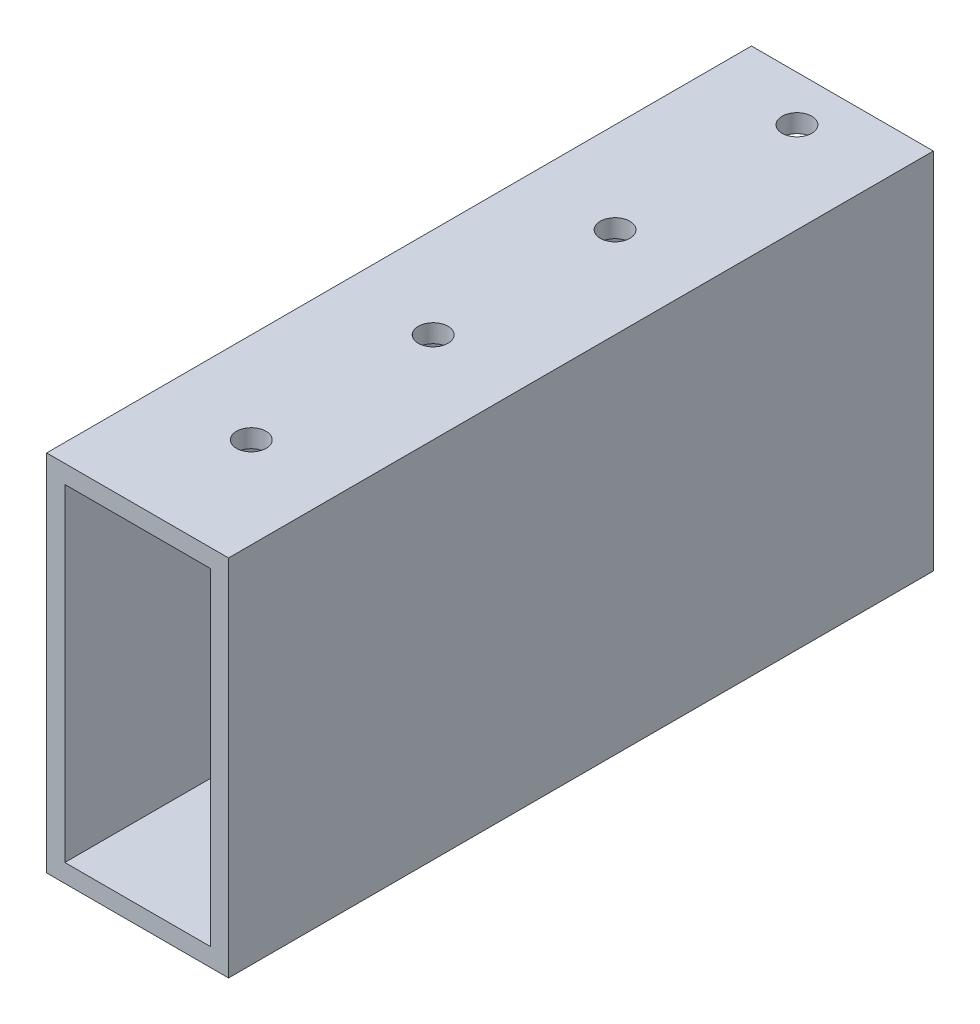
ISO-10303-21;
HEADER;
FILE_DESCRIPTION(('STEP AP214'),'2;1');
FILE_NAME('part.step','',(''),(''),'','','');
FILE_SCHEMA(('AUTOMOTIVE_DESIGN { 1 0 10303 214 1 1 1 1 }'));
ENDSEC;
DATA;
#1=APPLICATION_CONTEXT('core data for automotive mechanical design processes');
#2=APPLICATION_PROTOCOL_DEFINITION('international standard','automotive_design',2000,#1);
#3=PRODUCT_CONTEXT('',#1,'mechanical');
#4=PRODUCT('Part','Part','',(#3));
#5=PRODUCT_RELATED_PRODUCT_CATEGORY('part','',(#4));
#6=PRODUCT_DEFINITION_FORMATION('','',#4);
#7=PRODUCT_DEFINITION_CONTEXT('part definition',#1,'design');
#8=PRODUCT_DEFINITION('design','',#6,#7);
#9=PRODUCT_DEFINITION_SHAPE('','',#8);
#10=(LENGTH_UNIT() NAMED_UNIT(*) SI_UNIT(.MILLI.,.METRE.));
#11=(NAMED_UNIT(*) PLANE_ANGLE_UNIT() SI_UNIT($,.RADIAN.));
#12=(NAMED_UNIT(*) SI_UNIT($,.STERADIAN.) SOLID_ANGLE_UNIT());
#13=UNCERTAINTY_MEASURE_WITH_UNIT(LENGTH_MEASURE(1.E-05),#10,'distance_accuracy_value','');
#14=(GEOMETRIC_REPRESENTATION_CONTEXT(3) GLOBAL_UNCERTAINTY_ASSIGNED_CONTEXT((#13)) GLOBAL_UNIT_ASSIGNED_CONTEXT((#10,
#11,#12)) REPRESENTATION_CONTEXT('',''));
#15=CARTESIAN_POINT('',(0.,0.,0.));
#16=DIRECTION('',(0.,0.,1.));
#17=DIRECTION('',(1.,0.,0.));
#18=AXIS2_PLACEMENT_3D('',#15,#16,#17);
#19=CARTESIAN_POINT('',(0.,-25.4,6.35));
#20=DIRECTION('',(0.,1.,0.));
#21=DIRECTION('',(0.,0.,1.));
#22=AXIS2_PLACEMENT_3D('',#19,#20,#21);
#23=CYLINDRICAL_SURFACE('',#22,2.0701);
#24=CARTESIAN_POINT('',(0.,22.86,6.35));
#25=DIRECTION('',(0.,1.,0.));
#26=DIRECTION('',(0.,0.,1.));
#27=AXIS2_PLACEMENT_3D('',#24,#25,#26);
#28=CIRCLE('',#27,2.0701);
#29=CARTESIAN_POINT('',(0.,22.86,8.4201));
#30=VERTEX_POINT('',#29);
#31=EDGE_CURVE('E125',#30,#30,#28,.T.);
#32=ORIENTED_EDGE('',*,*,#31,.F.);
#33=EDGE_LOOP('',(#32));
#34=FACE_BOUND('',#33,.T.);
#35=CARTESIAN_POINT('',(0.,25.4,6.35));
#36=DIRECTION('',(0.,1.,0.));
#37=DIRECTION('',(0.,0.,1.));
#38=AXIS2_PLACEMENT_3D('',#35,#36,#37);
#39=CIRCLE('',#38,2.0701);
#40=CARTESIAN_POINT('',(0.,25.4,8.4201));
#41=VERTEX_POINT('',#40);
#42=EDGE_CURVE('E101',#41,#41,#39,.T.);
#43=ORIENTED_EDGE('',*,*,#42,.T.);
#44=EDGE_LOOP('',(#43));
#45=FACE_BOUND('',#44,.T.);
#46=ADVANCED_FACE('F17',(#34,#45),#23,.F.);
#47=CARTESIAN_POINT('',(0.,-25.4,31.75));
#48=DIRECTION('',(0.,1.,0.));
#49=DIRECTION('',(0.,0.,1.));
#50=AXIS2_PLACEMENT_3D('',#47,#48,#49);
#51=CYLINDRICAL_SURFACE('',#50,2.0701);
#52=CARTESIAN_POINT('',(0.,22.86,31.75));
#53=DIRECTION('',(0.,1.,0.));
#54=DIRECTION('',(0.,0.,1.));
#55=AXIS2_PLACEMENT_3D('',#52,#53,#54);
#56=CIRCLE('',#55,2.0701);
#57=CARTESIAN_POINT('',(0.,22.86,33.8201));
#58=VERTEX_POINT('',#57);
#59=EDGE_CURVE('E155',#58,#58,#56,.T.);
#60=ORIENTED_EDGE('',*,*,#59,.F.);
#61=EDGE_LOOP('',(#60));
#62=FACE_BOUND('',#61,.T.);
#63=CARTESIAN_POINT('',(0.,25.4,31.75));
#64=DIRECTION('',(0.,1.,0.));
#65=DIRECTION('',(0.,0.,1.));
#66=AXIS2_PLACEMENT_3D('',#63,#64,#65);
#67=CIRCLE('',#66,2.0701);
#68=CARTESIAN_POINT('',(0.,25.4,33.8201));
#69=VERTEX_POINT('',#68);
#70=EDGE_CURVE('E145',#69,#69,#67,.T.);
#71=ORIENTED_EDGE('',*,*,#70,.T.);
#72=EDGE_LOOP('',(#71));
#73=FACE_BOUND('',#72,.T.);
#74=ADVANCED_FACE('F341',(#62,#73),#51,.F.);
#75=CARTESIAN_POINT('',(0.,-25.4,57.15));
#76=DIRECTION('',(0.,1.,0.));
#77=DIRECTION('',(0.,0.,1.));
#78=AXIS2_PLACEMENT_3D('',#75,#76,#77);
#79=CYLINDRICAL_SURFACE('',#78,2.07010000000001);
#80=CARTESIAN_POINT('',(0.,22.86,57.15));
#81=DIRECTION('',(0.,1.,0.));
#82=DIRECTION('',(0.,0.,1.));
#83=AXIS2_PLACEMENT_3D('',#80,#81,#82);
#84=CIRCLE('',#83,2.07010000000001);
#85=CARTESIAN_POINT('',(0.,22.86,59.2201));
#86=VERTEX_POINT('',#85);
#87=EDGE_CURVE('E152',#86,#86,#84,.T.);
#88=ORIENTED_EDGE('',*,*,#87,.F.);
#89=EDGE_LOOP('',(#88));
#90=FACE_BOUND('',#89,.T.);
#91=CARTESIAN_POINT('',(0.,25.4,57.15));
#92=DIRECTION('',(0.,1.,0.));
#93=DIRECTION('',(0.,0.,1.));
#94=AXIS2_PLACEMENT_3D('',#91,#92,#93);
#95=CIRCLE('',#94,2.07010000000001);
#96=CARTESIAN_POINT('',(0.,25.4,59.2201));
#97=VERTEX_POINT('',#96);
#98=EDGE_CURVE('E142',#97,#97,#95,.T.);
#99=ORIENTED_EDGE('',*,*,#98,.T.);
#100=EDGE_LOOP('',(#99));
#101=FACE_BOUND('',#100,.T.);
#102=ADVANCED_FACE('F187',(#90,#101),#79,.F.);
#103=CARTESIAN_POINT('',(0.,-25.4,82.55));
#104=DIRECTION('',(0.,1.,0.));
#105=DIRECTION('',(0.,0.,1.));
#106=AXIS2_PLACEMENT_3D('',#103,#104,#105);
#107=CYLINDRICAL_SURFACE('',#106,2.07010000000001);
#108=CARTESIAN_POINT('',(0.,22.86,82.55));
#109=DIRECTION('',(0.,1.,0.));
#110=DIRECTION('',(0.,0.,1.));
#111=AXIS2_PLACEMENT_3D('',#108,#109,#110);
#112=CIRCLE('',#111,2.07010000000001);
#113=CARTESIAN_POINT('',(0.,22.86,84.6201));
#114=VERTEX_POINT('',#113);
#115=EDGE_CURVE('E122',#114,#114,#112,.T.);
#116=ORIENTED_EDGE('',*,*,#115,.F.);
#117=EDGE_LOOP('',(#116));
#118=FACE_BOUND('',#117,.T.);
#119=CARTESIAN_POINT('',(0.,25.4,82.55));
#120=DIRECTION('',(0.,1.,0.));
#121=DIRECTION('',(0.,0.,1.));
#122=AXIS2_PLACEMENT_3D('',#119,#120,#121);
#123=CIRCLE('',#122,2.07010000000001);
#124=CARTESIAN_POINT('',(0.,25.4,84.6201));
#125=VERTEX_POINT('',#124);
#126=EDGE_CURVE('E117',#125,#125,#123,.T.);
#127=ORIENTED_EDGE('',*,*,#126,.T.);
#128=EDGE_LOOP('',(#127));
#129=FACE_BOUND('',#128,.T.);
#130=ADVANCED_FACE('F176',(#118,#129),#107,.F.);
#131=CARTESIAN_POINT('',(0.,-25.4,6.35));
#132=DIRECTION('',(0.,1.,0.));
#133=DIRECTION('',(0.,0.,1.));
#134=AXIS2_PLACEMENT_3D('',#131,#132,#133);
#135=CYLINDRICAL_SURFACE('',#134,2.0701);
#136=CARTESIAN_POINT('',(0.,-25.4,6.35));
#137=DIRECTION('',(0.,1.,0.));
#138=DIRECTION('',(0.,0.,1.));
#139=AXIS2_PLACEMENT_3D('',#136,#137,#138);
#140=CIRCLE('',#139,2.0701);
#141=CARTESIAN_POINT('',(0.,-25.4,8.4201));
#142=VERTEX_POINT('',#141);
#143=EDGE_CURVE('E137',#142,#142,#140,.F.);
#144=ORIENTED_EDGE('',*,*,#143,.T.);
#145=EDGE_LOOP('',(#144));
#146=FACE_BOUND('',#145,.T.);
#147=CARTESIAN_POINT('',(0.,-22.86,6.35));
#148=DIRECTION('',(0.,1.,0.));
#149=DIRECTION('',(0.,0.,1.));
#150=AXIS2_PLACEMENT_3D('',#147,#148,#149);
#151=CIRCLE('',#150,2.0701);
#152=CARTESIAN_POINT('',(0.,-22.86,8.4201));
#153=VERTEX_POINT('',#152);
#154=EDGE_CURVE('E20',#153,#153,#151,.F.);
#155=ORIENTED_EDGE('',*,*,#154,.F.);
#156=EDGE_LOOP('',(#155));
#157=FACE_BOUND('',#156,.T.);
#158=ADVANCED_FACE('F173',(#146,#157),#135,.F.);
#159=CARTESIAN_POINT('',(0.,-25.4,31.75));
#160=DIRECTION('',(0.,1.,0.));
#161=DIRECTION('',(0.,0.,1.));
#162=AXIS2_PLACEMENT_3D('',#159,#160,#161);
#163=CYLINDRICAL_SURFACE('',#162,2.0701);
#164=CARTESIAN_POINT('',(0.,-25.4,31.75));
#165=DIRECTION('',(0.,1.,0.));
#166=DIRECTION('',(0.,0.,1.));
#167=AXIS2_PLACEMENT_3D('',#164,#165,#166);
#168=CIRCLE('',#167,2.0701);
#169=CARTESIAN_POINT('',(0.,-25.4,33.8201));
#170=VERTEX_POINT('',#169);
#171=EDGE_CURVE('E134',#170,#170,#168,.F.);
#172=ORIENTED_EDGE('',*,*,#171,.T.);
#173=EDGE_LOOP('',(#172));
#174=FACE_BOUND('',#173,.T.);
#175=CARTESIAN_POINT('',(0.,-22.86,31.75));
#176=DIRECTION('',(0.,1.,0.));
#177=DIRECTION('',(0.,0.,1.));
#178=AXIS2_PLACEMENT_3D('',#175,#176,#177);
#179=CIRCLE('',#178,2.0701);
#180=CARTESIAN_POINT('',(0.,-22.86,33.8201));
#181=VERTEX_POINT('',#180);
#182=EDGE_CURVE('E164',#181,#181,#179,.F.);
#183=ORIENTED_EDGE('',*,*,#182,.F.);
#184=EDGE_LOOP('',(#183));
#185=FACE_BOUND('',#184,.T.);
#186=ADVANCED_FACE('F175',(#174,#185),#163,.F.);
#187=CARTESIAN_POINT('',(0.,-25.4,57.15));
#188=DIRECTION('',(0.,1.,0.));
#189=DIRECTION('',(0.,0.,1.));
#190=AXIS2_PLACEMENT_3D('',#187,#188,#189);
#191=CYLINDRICAL_SURFACE('',#190,2.07010000000001);
#192=CARTESIAN_POINT('',(0.,-25.4,57.15));
#193=DIRECTION('',(0.,1.,0.));
#194=DIRECTION('',(0.,0.,1.));
#195=AXIS2_PLACEMENT_3D('',#192,#193,#194);
#196=CIRCLE('',#195,2.07010000000001);
#197=CARTESIAN_POINT('',(0.,-25.4,59.2201));
#198=VERTEX_POINT('',#197);
#199=EDGE_CURVE('E131',#198,#198,#196,.F.);
#200=ORIENTED_EDGE('',*,*,#199,.T.);
#201=EDGE_LOOP('',(#200));
#202=FACE_BOUND('',#201,.T.);
#203=CARTESIAN_POINT('',(0.,-22.86,57.15));
#204=DIRECTION('',(0.,1.,0.));
#205=DIRECTION('',(0.,0.,1.));
#206=AXIS2_PLACEMENT_3D('',#203,#204,#205);
#207=CIRCLE('',#206,2.07010000000001);
#208=CARTESIAN_POINT('',(0.,-22.86,59.2201));
#209=VERTEX_POINT('',#208);
#210=EDGE_CURVE('E162',#209,#209,#207,.F.);
#211=ORIENTED_EDGE('',*,*,#210,.F.);
#212=EDGE_LOOP('',(#211));
#213=FACE_BOUND('',#212,.T.);
#214=ADVANCED_FACE('F184',(#202,#213),#191,.F.);
#215=CARTESIAN_POINT('',(0.,-25.4,82.55));
#216=DIRECTION('',(0.,1.,0.));
#217=DIRECTION('',(0.,0.,1.));
#218=AXIS2_PLACEMENT_3D('',#215,#216,#217);
#219=CYLINDRICAL_SURFACE('',#218,2.07010000000001);
#220=CARTESIAN_POINT('',(0.,-25.4,82.55));
#221=DIRECTION('',(0.,1.,0.));
#222=DIRECTION('',(0.,0.,1.));
#223=AXIS2_PLACEMENT_3D('',#220,#221,#222);
#224=CIRCLE('',#223,2.07010000000001);
#225=CARTESIAN_POINT('',(0.,-25.4,84.6201));
#226=VERTEX_POINT('',#225);
#227=EDGE_CURVE('E127',#226,#226,#224,.F.);
#228=ORIENTED_EDGE('',*,*,#227,.T.);
#229=EDGE_LOOP('',(#228));
#230=FACE_BOUND('',#229,.T.);
#231=CARTESIAN_POINT('',(0.,-22.86,82.55));
#232=DIRECTION('',(0.,1.,0.));
#233=DIRECTION('',(0.,0.,1.));
#234=AXIS2_PLACEMENT_3D('',#231,#232,#233);
#235=CIRCLE('',#234,2.07010000000001);
#236=CARTESIAN_POINT('',(0.,-22.86,84.6201));
#237=VERTEX_POINT('',#236);
#238=EDGE_CURVE('E126',#237,#237,#235,.F.);
#239=ORIENTED_EDGE('',*,*,#238,.F.);
#240=EDGE_LOOP('',(#239));
#241=FACE_BOUND('',#240,.T.);
#242=ADVANCED_FACE('F226',(#230,#241),#219,.F.);
#243=CARTESIAN_POINT('',(12.7,-25.4,98.425));
#244=DIRECTION('',(-1.,0.,0.));
#245=DIRECTION('',(0.,0.,1.));
#246=AXIS2_PLACEMENT_3D('',#243,#244,#245);
#247=PLANE('',#246);
#248=DIRECTION('',(0.,0.,-1.));
#249=VECTOR('',#248,1.);
#250=CARTESIAN_POINT('',(12.7,25.4,98.425));
#251=LINE('',#250,#249);
#252=CARTESIAN_POINT('',(12.7,25.4,0.));
#253=VERTEX_POINT('',#252);
#254=CARTESIAN_POINT('',(12.7,25.4,98.425));
#255=VERTEX_POINT('',#254);
#256=EDGE_CURVE('E115',#253,#255,#251,.F.);
#257=ORIENTED_EDGE('',*,*,#256,.T.);
#258=DIRECTION('',(0.,1.,0.));
#259=VECTOR('',#258,1.);
#260=CARTESIAN_POINT('',(12.7,0.,98.425));
#261=LINE('',#260,#259);
#262=CARTESIAN_POINT('',(12.7,-25.4,98.425));
#263=VERTEX_POINT('',#262);
#264=EDGE_CURVE('E112',#263,#255,#261,.T.);
#265=ORIENTED_EDGE('',*,*,#264,.F.);
#266=DIRECTION('',(0.,0.,1.));
#267=VECTOR('',#266,1.);
#268=CARTESIAN_POINT('',(12.7,-25.4,98.425));
#269=LINE('',#268,#267);
#270=CARTESIAN_POINT('',(12.7,-25.4,0.));
#271=VERTEX_POINT('',#270);
#272=EDGE_CURVE('E413',#263,#271,#269,.F.);
#273=ORIENTED_EDGE('',*,*,#272,.T.);
#274=DIRECTION('',(0.,1.,0.));
#275=VECTOR('',#274,1.);
#276=CARTESIAN_POINT('',(12.7,0.,0.));
#277=LINE('',#276,#275);
#278=EDGE_CURVE('E385',#271,#253,#277,.T.);
#279=ORIENTED_EDGE('',*,*,#278,.T.);
#280=EDGE_LOOP('',(#257,#265,#273,#279));
#281=FACE_BOUND('',#280,.T.);
#282=ADVANCED_FACE('F222',(#281),#247,.F.);
#283=CARTESIAN_POINT('',(10.16,-22.86,98.425));
#284=DIRECTION('',(0.,1.,0.));
#285=DIRECTION('',(-1.,0.,0.));
#286=AXIS2_PLACEMENT_3D('',#283,#284,#285);
#287=PLANE('',#286);
#288=DIRECTION('',(1.,0.,0.));
#289=VECTOR('',#288,1.);
#290=CARTESIAN_POINT('',(0.,-22.86,98.425));
#291=LINE('',#290,#289);
#292=CARTESIAN_POINT('',(10.16,-22.86,98.425));
#293=VERTEX_POINT('',#292);
#294=CARTESIAN_POINT('',(-10.16,-22.86,98.425));
#295=VERTEX_POINT('',#294);
#296=EDGE_CURVE('E106',#293,#295,#291,.F.);
#297=ORIENTED_EDGE('',*,*,#296,.F.);
#298=DIRECTION('',(0.,0.,1.));
#299=VECTOR('',#298,1.);
#300=CARTESIAN_POINT('',(10.16,-22.86,98.425));
#301=LINE('',#300,#299);
#302=CARTESIAN_POINT('',(10.16,-22.86,0.));
#303=VERTEX_POINT('',#302);
#304=EDGE_CURVE('E102',#303,#293,#301,.T.);
#305=ORIENTED_EDGE('',*,*,#304,.F.);
#306=DIRECTION('',(1.,0.,0.));
#307=VECTOR('',#306,1.);
#308=CARTESIAN_POINT('',(0.,-22.86,0.));
#309=LINE('',#308,#307);
#310=CARTESIAN_POINT('',(-10.16,-22.86,0.));
#311=VERTEX_POINT('',#310);
#312=EDGE_CURVE('E406',#303,#311,#309,.F.);
#313=ORIENTED_EDGE('',*,*,#312,.T.);
#314=DIRECTION('',(0.,0.,-1.));
#315=VECTOR('',#314,1.);
#316=CARTESIAN_POINT('',(-10.16,-22.86,98.425));
#317=LINE('',#316,#315);
#318=EDGE_CURVE('E123',#295,#311,#317,.T.);
#319=ORIENTED_EDGE('',*,*,#318,.F.);
#320=EDGE_LOOP('',(#297,#305,#313,#319));
#321=FACE_BOUND('',#320,.T.);
#322=ORIENTED_EDGE('',*,*,#238,.T.);
#323=EDGE_LOOP('',(#322));
#324=FACE_BOUND('',#323,.T.);
#325=ORIENTED_EDGE('',*,*,#210,.T.);
#326=EDGE_LOOP('',(#325));
#327=FACE_BOUND('',#326,.T.);
#328=ORIENTED_EDGE('',*,*,#182,.T.);
#329=EDGE_LOOP('',(#328));
#330=FACE_BOUND('',#329,.T.);
#331=ORIENTED_EDGE('',*,*,#154,.T.);
#332=EDGE_LOOP('',(#331));
#333=FACE_BOUND('',#332,.T.);
#334=ADVANCED_FACE('F171',(#321,#324,#327,#330,#333),#287,.T.);
#335=CARTESIAN_POINT('',(-10.16,-22.86,98.425));
#336=DIRECTION('',(1.,0.,0.));
#337=DIRECTION('',(0.,0.,-1.));
#338=AXIS2_PLACEMENT_3D('',#335,#336,#337);
#339=PLANE('',#338);
#340=DIRECTION('',(0.,1.,0.));
#341=VECTOR('',#340,1.);
#342=CARTESIAN_POINT('',(-10.16,0.,98.425));
#343=LINE('',#342,#341);
#344=CARTESIAN_POINT('',(-10.16,22.86,98.425));
#345=VERTEX_POINT('',#344);
#346=EDGE_CURVE('E88',#295,#345,#343,.T.);
#347=ORIENTED_EDGE('',*,*,#346,.F.);
#348=ORIENTED_EDGE('',*,*,#318,.T.);
#349=DIRECTION('',(0.,1.,0.));
#350=VECTOR('',#349,1.);
#351=CARTESIAN_POINT('',(-10.16,0.,0.));
#352=LINE('',#351,#350);
#353=CARTESIAN_POINT('',(-10.16,22.86,0.));
#354=VERTEX_POINT('',#353);
#355=EDGE_CURVE('E403',#311,#354,#352,.T.);
#356=ORIENTED_EDGE('',*,*,#355,.T.);
#357=DIRECTION('',(0.,0.,1.));
#358=VECTOR('',#357,1.);
#359=CARTESIAN_POINT('',(-10.16,22.86,98.425));
#360=LINE('',#359,#358);
#361=EDGE_CURVE('E120',#345,#354,#360,.F.);
#362=ORIENTED_EDGE('',*,*,#361,.F.);
#363=EDGE_LOOP('',(#347,#348,#356,#362));
#364=FACE_BOUND('',#363,.T.);
#365=ADVANCED_FACE('F216',(#364),#339,.T.);
#366=CARTESIAN_POINT('',(10.16,22.86,98.425));
#367=DIRECTION('',(0.,-1.,0.));
#368=DIRECTION('',(1.,0.,0.));
#369=AXIS2_PLACEMENT_3D('',#366,#367,#368);
#370=PLANE('',#369);
#371=DIRECTION('',(1.,0.,0.));
#372=VECTOR('',#371,1.);
#373=CARTESIAN_POINT('',(0.,22.86,98.425));
#374=LINE('',#373,#372);
#375=CARTESIAN_POINT('',(10.16,22.86,98.425));
#376=VERTEX_POINT('',#375);
#377=EDGE_CURVE('E80',#345,#376,#374,.T.);
#378=ORIENTED_EDGE('',*,*,#377,.F.);
#379=ORIENTED_EDGE('',*,*,#361,.T.);
#380=DIRECTION('',(1.,0.,0.));
#381=VECTOR('',#380,1.);
#382=CARTESIAN_POINT('',(0.,22.86,0.));
#383=LINE('',#382,#381);
#384=CARTESIAN_POINT('',(10.16,22.86,0.));
#385=VERTEX_POINT('',#384);
#386=EDGE_CURVE('E97',#354,#385,#383,.T.);
#387=ORIENTED_EDGE('',*,*,#386,.T.);
#388=DIRECTION('',(0.,0.,1.));
#389=VECTOR('',#388,1.);
#390=CARTESIAN_POINT('',(10.16,22.86,98.425));
#391=LINE('',#390,#389);
#392=EDGE_CURVE('E93',#376,#385,#391,.F.);
#393=ORIENTED_EDGE('',*,*,#392,.F.);
#394=EDGE_LOOP('',(#378,#379,#387,#393));
#395=FACE_BOUND('',#394,.T.);
#396=ORIENTED_EDGE('',*,*,#115,.T.);
#397=EDGE_LOOP('',(#396));
#398=FACE_BOUND('',#397,.T.);
#399=ORIENTED_EDGE('',*,*,#87,.T.);
#400=EDGE_LOOP('',(#399));
#401=FACE_BOUND('',#400,.T.);
#402=ORIENTED_EDGE('',*,*,#59,.T.);
#403=EDGE_LOOP('',(#402));
#404=FACE_BOUND('',#403,.T.);
#405=ORIENTED_EDGE('',*,*,#31,.T.);
#406=EDGE_LOOP('',(#405));
#407=FACE_BOUND('',#406,.T.);
#408=ADVANCED_FACE('F94',(#395,#398,#401,#404,#407),#370,.T.);
#409=CARTESIAN_POINT('',(10.16,-22.86,98.425));
#410=DIRECTION('',(-1.,0.,0.));
#411=DIRECTION('',(0.,0.,1.));
#412=AXIS2_PLACEMENT_3D('',#409,#410,#411);
#413=PLANE('',#412);
#414=DIRECTION('',(0.,1.,0.));
#415=VECTOR('',#414,1.);
#416=CARTESIAN_POINT('',(10.16,0.,98.425));
#417=LINE('',#416,#415);
#418=EDGE_CURVE('E85',#376,#293,#417,.F.);
#419=ORIENTED_EDGE('',*,*,#418,.F.);
#420=ORIENTED_EDGE('',*,*,#392,.T.);
#421=DIRECTION('',(0.,1.,0.));
#422=VECTOR('',#421,1.);
#423=CARTESIAN_POINT('',(10.16,0.,0.));
#424=LINE('',#423,#422);
#425=EDGE_CURVE('E398',#385,#303,#424,.F.);
#426=ORIENTED_EDGE('',*,*,#425,.T.);
#427=ORIENTED_EDGE('',*,*,#304,.T.);
#428=EDGE_LOOP('',(#419,#420,#426,#427));
#429=FACE_BOUND('',#428,.T.);
#430=ADVANCED_FACE('F104',(#429),#413,.T.);
#431=CARTESIAN_POINT('',(12.7,25.4,98.425));
#432=DIRECTION('',(0.,-1.,0.));
#433=DIRECTION('',(0.,0.,-1.));
#434=AXIS2_PLACEMENT_3D('',#431,#432,#433);
#435=PLANE('',#434);
#436=DIRECTION('',(0.,0.,-1.));
#437=VECTOR('',#436,1.);
#438=CARTESIAN_POINT('',(-12.7,25.4,98.425));
#439=LINE('',#438,#437);
#440=CARTESIAN_POINT('',(-12.7,25.4,0.));
#441=VERTEX_POINT('',#440);
#442=CARTESIAN_POINT('',(-12.7,25.4,98.425));
#443=VERTEX_POINT('',#442);
#444=EDGE_CURVE('E390',#441,#443,#439,.F.);
#445=ORIENTED_EDGE('',*,*,#444,.T.);
#446=DIRECTION('',(1.,0.,0.));
#447=VECTOR('',#446,1.);
#448=CARTESIAN_POINT('',(0.,25.4,98.425));
#449=LINE('',#448,#447);
#450=EDGE_CURVE('E90',#255,#443,#449,.F.);
#451=ORIENTED_EDGE('',*,*,#450,.F.);
#452=ORIENTED_EDGE('',*,*,#256,.F.);
#453=DIRECTION('',(1.,0.,0.));
#454=VECTOR('',#453,1.);
#455=CARTESIAN_POINT('',(0.,25.4,0.));
#456=LINE('',#455,#454);
#457=EDGE_CURVE('E409',#253,#441,#456,.F.);
#458=ORIENTED_EDGE('',*,*,#457,.T.);
#459=EDGE_LOOP('',(#445,#451,#452,#458));
#460=FACE_BOUND('',#459,.T.);
#461=ORIENTED_EDGE('',*,*,#126,.F.);
#462=EDGE_LOOP('',(#461));
#463=FACE_BOUND('',#462,.T.);
#464=ORIENTED_EDGE('',*,*,#98,.F.);
#465=EDGE_LOOP('',(#464));
#466=FACE_BOUND('',#465,.T.);
#467=ORIENTED_EDGE('',*,*,#70,.F.);
#468=EDGE_LOOP('',(#467));
#469=FACE_BOUND('',#468,.T.);
#470=ORIENTED_EDGE('',*,*,#42,.F.);
#471=EDGE_LOOP('',(#470));
#472=FACE_BOUND('',#471,.T.);
#473=ADVANCED_FACE('F208',(#460,#463,#466,#469,#472),#435,.F.);
#474=CARTESIAN_POINT('',(0.,0.,98.425));
#475=DIRECTION('',(0.,0.,1.));
#476=DIRECTION('',(1.,0.,0.));
#477=AXIS2_PLACEMENT_3D('',#474,#475,#476);
#478=PLANE('',#477);
#479=ORIENTED_EDGE('',*,*,#296,.T.);
#480=ORIENTED_EDGE('',*,*,#346,.T.);
#481=ORIENTED_EDGE('',*,*,#377,.T.);
#482=ORIENTED_EDGE('',*,*,#418,.T.);
#483=EDGE_LOOP('',(#479,#480,#481,#482));
#484=FACE_BOUND('',#483,.T.);
#485=ORIENTED_EDGE('',*,*,#264,.T.);
#486=ORIENTED_EDGE('',*,*,#450,.T.);
#487=DIRECTION('',(0.,1.,0.));
#488=VECTOR('',#487,1.);
#489=CARTESIAN_POINT('',(-12.7,-25.4,98.425));
#490=LINE('',#489,#488);
#491=CARTESIAN_POINT('',(-12.7,-25.4,98.425));
#492=VERTEX_POINT('',#491);
#493=EDGE_CURVE('E394',#443,#492,#490,.F.);
#494=ORIENTED_EDGE('',*,*,#493,.T.);
#495=DIRECTION('',(1.,0.,0.));
#496=VECTOR('',#495,1.);
#497=CARTESIAN_POINT('',(12.7,-25.4,98.425));
#498=LINE('',#497,#496);
#499=EDGE_CURVE('E130',#492,#263,#498,.T.);
#500=ORIENTED_EDGE('',*,*,#499,.T.);
#501=EDGE_LOOP('',(#485,#486,#494,#500));
#502=FACE_BOUND('',#501,.T.);
#503=ADVANCED_FACE('F82',(#484,#502),#478,.T.);
#504=CARTESIAN_POINT('',(12.7,-25.4,98.425));
#505=DIRECTION('',(0.,1.,0.));
#506=DIRECTION('',(0.,0.,1.));
#507=AXIS2_PLACEMENT_3D('',#504,#505,#506);
#508=PLANE('',#507);
#509=ORIENTED_EDGE('',*,*,#272,.F.);
#510=ORIENTED_EDGE('',*,*,#499,.F.);
#511=DIRECTION('',(0.,0.,-1.));
#512=VECTOR('',#511,1.);
#513=CARTESIAN_POINT('',(-12.7,-25.4,98.425));
#514=LINE('',#513,#512);
#515=CARTESIAN_POINT('',(-12.7,-25.4,0.));
#516=VERTEX_POINT('',#515);
#517=EDGE_CURVE('E26',#492,#516,#514,.T.);
#518=ORIENTED_EDGE('',*,*,#517,.T.);
#519=DIRECTION('',(1.,0.,0.));
#520=VECTOR('',#519,1.);
#521=CARTESIAN_POINT('',(0.,-25.4,0.));
#522=LINE('',#521,#520);
#523=EDGE_CURVE('E34',#516,#271,#522,.T.);
#524=ORIENTED_EDGE('',*,*,#523,.T.);
#525=EDGE_LOOP('',(#509,#510,#518,#524));
#526=FACE_BOUND('',#525,.T.);
#527=ORIENTED_EDGE('',*,*,#227,.F.);
#528=EDGE_LOOP('',(#527));
#529=FACE_BOUND('',#528,.T.);
#530=ORIENTED_EDGE('',*,*,#199,.F.);
#531=EDGE_LOOP('',(#530));
#532=FACE_BOUND('',#531,.T.);
#533=ORIENTED_EDGE('',*,*,#171,.F.);
#534=EDGE_LOOP('',(#533));
#535=FACE_BOUND('',#534,.T.);
#536=ORIENTED_EDGE('',*,*,#143,.F.);
#537=EDGE_LOOP('',(#536));
#538=FACE_BOUND('',#537,.T.);
#539=ADVANCED_FACE('F198',(#526,#529,#532,#535,#538),#508,.F.);
#540=CARTESIAN_POINT('',(0.,0.,0.));
#541=DIRECTION('',(0.,0.,1.));
#542=DIRECTION('',(1.,0.,0.));
#543=AXIS2_PLACEMENT_3D('',#540,#541,#542);
#544=PLANE('',#543);
#545=ORIENTED_EDGE('',*,*,#386,.F.);
#546=ORIENTED_EDGE('',*,*,#355,.F.);
#547=ORIENTED_EDGE('',*,*,#312,.F.);
#548=ORIENTED_EDGE('',*,*,#425,.F.);
#549=EDGE_LOOP('',(#545,#546,#547,#548));
#550=FACE_BOUND('',#549,.T.);
#551=ORIENTED_EDGE('',*,*,#457,.F.);
#552=ORIENTED_EDGE('',*,*,#278,.F.);
#553=ORIENTED_EDGE('',*,*,#523,.F.);
#554=DIRECTION('',(0.,1.,0.));
#555=VECTOR('',#554,1.);
#556=CARTESIAN_POINT('',(-12.7,-25.4,0.));
#557=LINE('',#556,#555);
#558=EDGE_CURVE('E11',#516,#441,#557,.T.);
#559=ORIENTED_EDGE('',*,*,#558,.T.);
#560=EDGE_LOOP('',(#551,#552,#553,#559));
#561=FACE_BOUND('',#560,.T.);
#562=ADVANCED_FACE('F192',(#550,#561),#544,.F.);
#563=CARTESIAN_POINT('',(-12.7,-25.4,98.425));
#564=DIRECTION('',(1.,0.,0.));
#565=DIRECTION('',(0.,0.,-1.));
#566=AXIS2_PLACEMENT_3D('',#563,#564,#565);
#567=PLANE('',#566);
#568=ORIENTED_EDGE('',*,*,#517,.F.);
#569=ORIENTED_EDGE('',*,*,#493,.F.);
#570=ORIENTED_EDGE('',*,*,#444,.F.);
#571=ORIENTED_EDGE('',*,*,#558,.F.);
#572=EDGE_LOOP('',(#568,#569,#570,#571));
#573=FACE_BOUND('',#572,.T.);
#574=ADVANCED_FACE('F190',(#573),#567,.F.);
#575=CLOSED_SHELL('',(#46,#74,#102,#130,#158,#186,#214,#242,#282,#334,#365,#408,#430,#473,#503,
#539,#562,#574));
#576=MANIFOLD_SOLID_BREP('B1',#575);
#577=ADVANCED_BREP_SHAPE_REPRESENTATION('',(#18,#576),#14);
#578=SHAPE_DEFINITION_REPRESENTATION(#9,#577);
ENDSEC;
END-ISO-10303-21;
